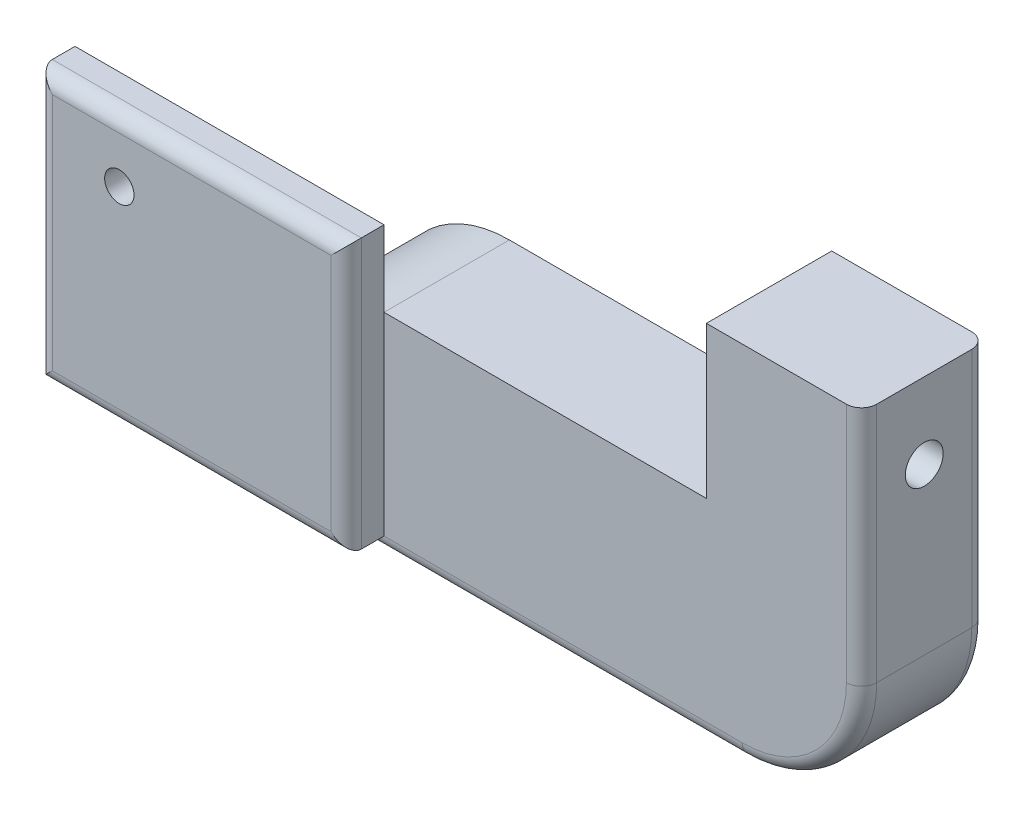
ISO-10303-21;
HEADER;
FILE_DESCRIPTION(('STEP AP214'),'2;1');
FILE_NAME('part.step','',(''),(''),'','','');
FILE_SCHEMA(('AUTOMOTIVE_DESIGN { 1 0 10303 214 1 1 1 1 }'));
ENDSEC;
DATA;
#1=APPLICATION_CONTEXT('core data for automotive mechanical design processes');
#2=APPLICATION_PROTOCOL_DEFINITION('international standard','automotive_design',2000,#1);
#3=PRODUCT_CONTEXT('',#1,'mechanical');
#4=PRODUCT('Part','Part','',(#3));
#5=PRODUCT_RELATED_PRODUCT_CATEGORY('part','',(#4));
#6=PRODUCT_DEFINITION_FORMATION('','',#4);
#7=PRODUCT_DEFINITION_CONTEXT('part definition',#1,'design');
#8=PRODUCT_DEFINITION('design','',#6,#7);
#9=PRODUCT_DEFINITION_SHAPE('','',#8);
#10=(LENGTH_UNIT() NAMED_UNIT(*) SI_UNIT(.MILLI.,.METRE.));
#11=(NAMED_UNIT(*) PLANE_ANGLE_UNIT() SI_UNIT($,.RADIAN.));
#12=(NAMED_UNIT(*) SI_UNIT($,.STERADIAN.) SOLID_ANGLE_UNIT());
#13=UNCERTAINTY_MEASURE_WITH_UNIT(LENGTH_MEASURE(1.E-05),#10,'distance_accuracy_value','');
#14=(GEOMETRIC_REPRESENTATION_CONTEXT(3) GLOBAL_UNCERTAINTY_ASSIGNED_CONTEXT((#13)) GLOBAL_UNIT_ASSIGNED_CONTEXT((#10,
#11,#12)) REPRESENTATION_CONTEXT('',''));
#15=CARTESIAN_POINT('',(0.,0.,0.));
#16=DIRECTION('',(0.,0.,1.));
#17=DIRECTION('',(1.,0.,0.));
#18=AXIS2_PLACEMENT_3D('',#15,#16,#17);
#19=CARTESIAN_POINT('',(24.,30.2,10.5));
#20=DIRECTION('',(-1.,0.,0.));
#21=DIRECTION('',(0.,0.,1.));
#22=AXIS2_PLACEMENT_3D('',#19,#20,#21);
#23=CYLINDRICAL_SURFACE('',#22,3.175);
#24=CARTESIAN_POINT('',(50.,30.2,10.5));
#25=DIRECTION('',(-1.,0.,0.));
#26=DIRECTION('',(0.,0.,1.));
#27=AXIS2_PLACEMENT_3D('',#24,#25,#26);
#28=CIRCLE('',#27,3.175);
#29=CARTESIAN_POINT('',(50.,30.2,13.675));
#30=VERTEX_POINT('',#29);
#31=EDGE_CURVE('E245',#30,#30,#28,.T.);
#32=ORIENTED_EDGE('',*,*,#31,.F.);
#33=EDGE_LOOP('',(#32));
#34=FACE_BOUND('',#33,.T.);
#35=CARTESIAN_POINT('',(40.475,30.2,10.5));
#36=DIRECTION('',(-1.,0.,0.));
#37=DIRECTION('',(0.,-1.,0.));
#38=AXIS2_PLACEMENT_3D('',#35,#36,#37);
#39=CIRCLE('',#38,3.175);
#40=CARTESIAN_POINT('',(40.475,27.025,10.5));
#41=VERTEX_POINT('',#40);
#42=EDGE_CURVE('E41',#41,#41,#39,.F.);
#43=ORIENTED_EDGE('',*,*,#42,.F.);
#44=EDGE_LOOP('',(#43));
#45=FACE_BOUND('',#44,.T.);
#46=ADVANCED_FACE('F37',(#34,#45),#23,.F.);
#47=CARTESIAN_POINT('',(-30.,-2.5,21.));
#48=DIRECTION('',(0.,0.,-1.));
#49=DIRECTION('',(-1.,0.,0.));
#50=AXIS2_PLACEMENT_3D('',#47,#48,#49);
#51=PLANE('',#50);
#52=DIRECTION('',(0.,1.,0.));
#53=VECTOR('',#52,1.);
#54=CARTESIAN_POINT('',(-30.,-14.96,21.));
#55=LINE('',#54,#53);
#56=CARTESIAN_POINT('',(-30.,-14.96,21.));
#57=VERTEX_POINT('',#56);
#58=CARTESIAN_POINT('',(-30.,17.5,21.));
#59=VERTEX_POINT('',#58);
#60=EDGE_CURVE('E257',#57,#59,#55,.T.);
#61=ORIENTED_EDGE('',*,*,#60,.F.);
#62=DIRECTION('',(1.,0.,0.));
#63=VECTOR('',#62,1.);
#64=CARTESIAN_POINT('',(-30.,-14.96,21.));
#65=LINE('',#64,#63);
#66=CARTESIAN_POINT('',(30.,-14.96,21.));
#67=VERTEX_POINT('',#66);
#68=EDGE_CURVE('E330',#57,#67,#65,.T.);
#69=ORIENTED_EDGE('',*,*,#68,.T.);
#70=CARTESIAN_POINT('',(30.,2.5,21.));
#71=DIRECTION('',(0.,0.,-1.));
#72=DIRECTION('',(-1.,0.,0.));
#73=AXIS2_PLACEMENT_3D('',#70,#71,#72);
#74=CIRCLE('',#73,17.46);
#75=CARTESIAN_POINT('',(47.46,2.5,21.));
#76=VERTEX_POINT('',#75);
#77=EDGE_CURVE('E328',#67,#76,#74,.F.);
#78=ORIENTED_EDGE('',*,*,#77,.T.);
#79=DIRECTION('',(0.,1.,0.));
#80=VECTOR('',#79,1.);
#81=CARTESIAN_POINT('',(47.46,-2.50000000000003,21.));
#82=LINE('',#81,#80);
#83=CARTESIAN_POINT('',(47.46,42.9,21.));
#84=VERTEX_POINT('',#83);
#85=EDGE_CURVE('E326',#76,#84,#82,.T.);
#86=ORIENTED_EDGE('',*,*,#85,.T.);
#87=DIRECTION('',(-1.,0.,0.));
#88=VECTOR('',#87,1.);
#89=CARTESIAN_POINT('',(24.,42.9,21.));
#90=LINE('',#89,#88);
#91=CARTESIAN_POINT('',(24.,42.9,21.));
#92=VERTEX_POINT('',#91);
#93=EDGE_CURVE('E278',#84,#92,#90,.T.);
#94=ORIENTED_EDGE('',*,*,#93,.T.);
#95=DIRECTION('',(0.,-1.,0.));
#96=VECTOR('',#95,1.);
#97=CARTESIAN_POINT('',(24.,17.5,21.));
#98=LINE('',#97,#96);
#99=CARTESIAN_POINT('',(24.,17.5,21.));
#100=VERTEX_POINT('',#99);
#101=EDGE_CURVE('E280',#92,#100,#98,.T.);
#102=ORIENTED_EDGE('',*,*,#101,.T.);
#103=DIRECTION('',(-1.,0.,0.));
#104=VECTOR('',#103,1.);
#105=CARTESIAN_POINT('',(-30.,17.5,21.));
#106=LINE('',#105,#104);
#107=EDGE_CURVE('E283',#100,#59,#106,.T.);
#108=ORIENTED_EDGE('',*,*,#107,.T.);
#109=EDGE_LOOP('',(#61,#69,#78,#86,#94,#102,#108));
#110=FACE_BOUND('',#109,.T.);
#111=ADVANCED_FACE('F470',(#110),#51,.F.);
#112=CARTESIAN_POINT('',(24.,42.9,21.));
#113=DIRECTION('',(0.,-1.,0.));
#114=DIRECTION('',(0.,0.,-1.));
#115=AXIS2_PLACEMENT_3D('',#112,#113,#114);
#116=PLANE('',#115);
#117=ORIENTED_EDGE('',*,*,#93,.F.);
#118=CARTESIAN_POINT('',(47.46,42.9,18.46));
#119=DIRECTION('',(0.,-1.,0.));
#120=DIRECTION('',(0.,0.,-1.));
#121=AXIS2_PLACEMENT_3D('',#118,#119,#120);
#122=CIRCLE('',#121,2.54);
#123=CARTESIAN_POINT('',(50.,42.9,18.46));
#124=VERTEX_POINT('',#123);
#125=EDGE_CURVE('E355',#84,#124,#122,.F.);
#126=ORIENTED_EDGE('',*,*,#125,.T.);
#127=DIRECTION('',(0.,0.,-1.));
#128=VECTOR('',#127,1.);
#129=CARTESIAN_POINT('',(50.,42.9,21.));
#130=LINE('',#129,#128);
#131=CARTESIAN_POINT('',(50.,42.9,2.54000000000001));
#132=VERTEX_POINT('',#131);
#133=EDGE_CURVE('E323',#124,#132,#130,.T.);
#134=ORIENTED_EDGE('',*,*,#133,.T.);
#135=CARTESIAN_POINT('',(47.46,42.9,2.54));
#136=DIRECTION('',(0.,-1.,0.));
#137=DIRECTION('',(0.,0.,-1.));
#138=AXIS2_PLACEMENT_3D('',#135,#136,#137);
#139=CIRCLE('',#138,2.54);
#140=CARTESIAN_POINT('',(47.46,42.9,0.));
#141=VERTEX_POINT('',#140);
#142=EDGE_CURVE('E353',#132,#141,#139,.F.);
#143=ORIENTED_EDGE('',*,*,#142,.T.);
#144=DIRECTION('',(-1.,0.,0.));
#145=VECTOR('',#144,1.);
#146=CARTESIAN_POINT('',(24.,42.9,0.));
#147=LINE('',#146,#145);
#148=CARTESIAN_POINT('',(24.,42.9,0.));
#149=VERTEX_POINT('',#148);
#150=EDGE_CURVE('E292',#141,#149,#147,.T.);
#151=ORIENTED_EDGE('',*,*,#150,.T.);
#152=DIRECTION('',(0.,0.,-1.));
#153=VECTOR('',#152,1.);
#154=CARTESIAN_POINT('',(24.,42.9,21.));
#155=LINE('',#154,#153);
#156=EDGE_CURVE('E320',#92,#149,#155,.T.);
#157=ORIENTED_EDGE('',*,*,#156,.F.);
#158=EDGE_LOOP('',(#117,#126,#134,#143,#151,#157));
#159=FACE_BOUND('',#158,.T.);
#160=ADVANCED_FACE('F456',(#159),#116,.F.);
#161=CARTESIAN_POINT('',(24.,17.5,21.));
#162=DIRECTION('',(1.,0.,0.));
#163=DIRECTION('',(0.,0.,-1.));
#164=AXIS2_PLACEMENT_3D('',#161,#162,#163);
#165=PLANE('',#164);
#166=DIRECTION('',(0.,0.,-1.));
#167=VECTOR('',#166,1.);
#168=CARTESIAN_POINT('',(24.,35.88325,13.7812259173719));
#169=LINE('',#168,#167);
#170=CARTESIAN_POINT('',(24.,35.88325,13.7812259173719));
#171=VERTEX_POINT('',#170);
#172=CARTESIAN_POINT('',(24.,35.88325,7.21877408262805));
#173=VERTEX_POINT('',#172);
#174=EDGE_CURVE('E215',#171,#173,#169,.T.);
#175=ORIENTED_EDGE('',*,*,#174,.F.);
#176=DIRECTION('',(0.,0.866025403784439,-0.5));
#177=VECTOR('',#176,1.);
#178=CARTESIAN_POINT('',(24.,30.2,17.0624518347439));
#179=LINE('',#178,#177);
#180=CARTESIAN_POINT('',(24.,30.2,17.0624518347439));
#181=VERTEX_POINT('',#180);
#182=EDGE_CURVE('E54',#181,#171,#179,.T.);
#183=ORIENTED_EDGE('',*,*,#182,.F.);
#184=DIRECTION('',(0.,0.866025403784438,0.5));
#185=VECTOR('',#184,1.);
#186=CARTESIAN_POINT('',(24.,24.51675,13.7812259173719));
#187=LINE('',#186,#185);
#188=CARTESIAN_POINT('',(24.,24.51675,13.7812259173719));
#189=VERTEX_POINT('',#188);
#190=EDGE_CURVE('E231',#189,#181,#187,.T.);
#191=ORIENTED_EDGE('',*,*,#190,.F.);
#192=DIRECTION('',(0.,0.,1.));
#193=VECTOR('',#192,1.);
#194=CARTESIAN_POINT('',(24.,24.51675,7.21877408262806));
#195=LINE('',#194,#193);
#196=CARTESIAN_POINT('',(24.,24.51675,7.21877408262806));
#197=VERTEX_POINT('',#196);
#198=EDGE_CURVE('E225',#197,#189,#195,.T.);
#199=ORIENTED_EDGE('',*,*,#198,.F.);
#200=DIRECTION('',(0.,-0.866025403784439,0.5));
#201=VECTOR('',#200,1.);
#202=CARTESIAN_POINT('',(24.,30.2,3.93754816525612));
#203=LINE('',#202,#201);
#204=CARTESIAN_POINT('',(24.,30.2,3.93754816525612));
#205=VERTEX_POINT('',#204);
#206=EDGE_CURVE('E223',#205,#197,#203,.T.);
#207=ORIENTED_EDGE('',*,*,#206,.F.);
#208=DIRECTION('',(0.,-0.866025403784439,-0.5));
#209=VECTOR('',#208,1.);
#210=CARTESIAN_POINT('',(24.,35.88325,7.21877408262805));
#211=LINE('',#210,#209);
#212=EDGE_CURVE('E205',#173,#205,#211,.T.);
#213=ORIENTED_EDGE('',*,*,#212,.F.);
#214=EDGE_LOOP('',(#175,#183,#191,#199,#207,#213));
#215=FACE_BOUND('',#214,.T.);
#216=DIRECTION('',(0.,-1.,0.));
#217=VECTOR('',#216,1.);
#218=CARTESIAN_POINT('',(24.,17.5,0.));
#219=LINE('',#218,#217);
#220=CARTESIAN_POINT('',(24.,17.5,0.));
#221=VERTEX_POINT('',#220);
#222=EDGE_CURVE('E294',#149,#221,#219,.T.);
#223=ORIENTED_EDGE('',*,*,#222,.T.);
#224=DIRECTION('',(0.,0.,-1.));
#225=VECTOR('',#224,1.);
#226=CARTESIAN_POINT('',(24.,17.5,21.));
#227=LINE('',#226,#225);
#228=EDGE_CURVE('E317',#100,#221,#227,.T.);
#229=ORIENTED_EDGE('',*,*,#228,.F.);
#230=ORIENTED_EDGE('',*,*,#101,.F.);
#231=ORIENTED_EDGE('',*,*,#156,.T.);
#232=EDGE_LOOP('',(#223,#229,#230,#231));
#233=FACE_BOUND('',#232,.T.);
#234=ADVANCED_FACE('F219',(#215,#233),#165,.F.);
#235=CARTESIAN_POINT('',(-30.,17.5,21.));
#236=DIRECTION('',(0.,-1.,0.));
#237=DIRECTION('',(1.,0.,0.));
#238=AXIS2_PLACEMENT_3D('',#235,#236,#237);
#239=PLANE('',#238);
#240=DIRECTION('',(-1.,0.,0.));
#241=VECTOR('',#240,1.);
#242=CARTESIAN_POINT('',(-30.,17.5,0.));
#243=LINE('',#242,#241);
#244=CARTESIAN_POINT('',(-30.,17.5,0.));
#245=VERTEX_POINT('',#244);
#246=EDGE_CURVE('E297',#221,#245,#243,.T.);
#247=ORIENTED_EDGE('',*,*,#246,.T.);
#248=DIRECTION('',(0.,0.,-1.));
#249=VECTOR('',#248,1.);
#250=CARTESIAN_POINT('',(-30.,17.5,21.));
#251=LINE('',#250,#249);
#252=EDGE_CURVE('E314',#59,#245,#251,.T.);
#253=ORIENTED_EDGE('',*,*,#252,.F.);
#254=ORIENTED_EDGE('',*,*,#107,.F.);
#255=ORIENTED_EDGE('',*,*,#228,.T.);
#256=EDGE_LOOP('',(#247,#253,#254,#255));
#257=FACE_BOUND('',#256,.T.);
#258=ADVANCED_FACE('F467',(#257),#239,.F.);
#259=CARTESIAN_POINT('',(-30.,-2.5,21.));
#260=DIRECTION('',(0.,0.,-1.));
#261=DIRECTION('',(-1.,0.,0.));
#262=AXIS2_PLACEMENT_3D('',#259,#260,#261);
#263=CYLINDRICAL_SURFACE('',#262,20.);
#264=CARTESIAN_POINT('',(-30.,-2.5,0.));
#265=DIRECTION('',(0.,0.,1.));
#266=DIRECTION('',(-1.,0.,0.));
#267=AXIS2_PLACEMENT_3D('',#264,#265,#266);
#268=CIRCLE('',#267,20.);
#269=CARTESIAN_POINT('',(-50.,-2.5,0.));
#270=VERTEX_POINT('',#269);
#271=EDGE_CURVE('E299',#245,#270,#268,.T.);
#272=ORIENTED_EDGE('',*,*,#271,.T.);
#273=DIRECTION('',(0.,0.,-1.));
#274=VECTOR('',#273,1.);
#275=CARTESIAN_POINT('',(-50.,-2.5,21.));
#276=LINE('',#275,#274);
#277=CARTESIAN_POINT('',(-50.,-2.5,21.));
#278=VERTEX_POINT('',#277);
#279=EDGE_CURVE('E311',#278,#270,#276,.T.);
#280=ORIENTED_EDGE('',*,*,#279,.F.);
#281=CARTESIAN_POINT('',(-30.,-2.5,21.));
#282=DIRECTION('',(0.,0.,1.));
#283=DIRECTION('',(-1.,0.,0.));
#284=AXIS2_PLACEMENT_3D('',#281,#282,#283);
#285=CIRCLE('',#284,20.);
#286=EDGE_CURVE('E285',#59,#278,#285,.T.);
#287=ORIENTED_EDGE('',*,*,#286,.F.);
#288=ORIENTED_EDGE('',*,*,#252,.T.);
#289=EDGE_LOOP('',(#272,#280,#287,#288));
#290=FACE_BOUND('',#289,.T.);
#291=ADVANCED_FACE('F534',(#290),#263,.T.);
#292=CARTESIAN_POINT('',(-50.,-17.5,21.));
#293=DIRECTION('',(1.,0.,0.));
#294=DIRECTION('',(0.,1.,0.));
#295=AXIS2_PLACEMENT_3D('',#292,#293,#294);
#296=PLANE('',#295);
#297=DIRECTION('',(0.,0.,-1.));
#298=VECTOR('',#297,1.);
#299=CARTESIAN_POINT('',(-50.,-17.5,21.));
#300=LINE('',#299,#298);
#301=CARTESIAN_POINT('',(-50.,-17.5,18.46));
#302=VERTEX_POINT('',#301);
#303=CARTESIAN_POINT('',(-50.,-17.5,2.54000000000001));
#304=VERTEX_POINT('',#303);
#305=EDGE_CURVE('E308',#302,#304,#300,.T.);
#306=ORIENTED_EDGE('',*,*,#305,.F.);
#307=CARTESIAN_POINT('',(-50.,-14.96,18.46));
#308=DIRECTION('',(1.,0.,0.));
#309=DIRECTION('',(0.,1.,0.));
#310=AXIS2_PLACEMENT_3D('',#307,#308,#309);
#311=CIRCLE('',#310,2.54);
#312=CARTESIAN_POINT('',(-50.,-14.96,21.));
#313=VERTEX_POINT('',#312);
#314=EDGE_CURVE('E341',#302,#313,#311,.F.);
#315=ORIENTED_EDGE('',*,*,#314,.T.);
#316=DIRECTION('',(0.,-1.,0.));
#317=VECTOR('',#316,1.);
#318=CARTESIAN_POINT('',(-50.,-17.5,21.));
#319=LINE('',#318,#317);
#320=EDGE_CURVE('E288',#278,#313,#319,.T.);
#321=ORIENTED_EDGE('',*,*,#320,.F.);
#322=ORIENTED_EDGE('',*,*,#279,.T.);
#323=DIRECTION('',(0.,-1.,0.));
#324=VECTOR('',#323,1.);
#325=CARTESIAN_POINT('',(-50.,-17.5,0.));
#326=LINE('',#325,#324);
#327=CARTESIAN_POINT('',(-50.,-14.96,0.));
#328=VERTEX_POINT('',#327);
#329=EDGE_CURVE('E281',#270,#328,#326,.T.);
#330=ORIENTED_EDGE('',*,*,#329,.T.);
#331=CARTESIAN_POINT('',(-50.,-14.96,2.54));
#332=DIRECTION('',(1.,0.,0.));
#333=DIRECTION('',(0.,1.,0.));
#334=AXIS2_PLACEMENT_3D('',#331,#332,#333);
#335=CIRCLE('',#334,2.54);
#336=EDGE_CURVE('E339',#328,#304,#335,.F.);
#337=ORIENTED_EDGE('',*,*,#336,.T.);
#338=EDGE_LOOP('',(#306,#315,#321,#322,#330,#337));
#339=FACE_BOUND('',#338,.T.);
#340=ADVANCED_FACE('F424',(#339),#296,.F.);
#341=CARTESIAN_POINT('',(-50.,-17.5,21.));
#342=DIRECTION('',(0.,1.,0.));
#343=DIRECTION('',(-1.,0.,0.));
#344=AXIS2_PLACEMENT_3D('',#341,#342,#343);
#345=PLANE('',#344);
#346=DIRECTION('',(0.,0.,-1.));
#347=VECTOR('',#346,1.);
#348=CARTESIAN_POINT('',(30.,-17.5,21.));
#349=LINE('',#348,#347);
#350=CARTESIAN_POINT('',(30.,-17.5,18.46));
#351=VERTEX_POINT('',#350);
#352=CARTESIAN_POINT('',(30.,-17.5,2.54000000000001));
#353=VERTEX_POINT('',#352);
#354=EDGE_CURVE('E305',#351,#353,#349,.T.);
#355=ORIENTED_EDGE('',*,*,#354,.F.);
#356=DIRECTION('',(1.,0.,0.));
#357=VECTOR('',#356,1.);
#358=CARTESIAN_POINT('',(-50.,-17.5,18.46));
#359=LINE('',#358,#357);
#360=EDGE_CURVE('E337',#351,#302,#359,.F.);
#361=ORIENTED_EDGE('',*,*,#360,.T.);
#362=ORIENTED_EDGE('',*,*,#305,.T.);
#363=DIRECTION('',(1.,0.,0.));
#364=VECTOR('',#363,1.);
#365=CARTESIAN_POINT('',(30.,-17.5,2.54));
#366=LINE('',#365,#364);
#367=EDGE_CURVE('E334',#304,#353,#366,.T.);
#368=ORIENTED_EDGE('',*,*,#367,.T.);
#369=EDGE_LOOP('',(#355,#361,#362,#368));
#370=FACE_BOUND('',#369,.T.);
#371=ADVANCED_FACE('F430',(#370),#345,.F.);
#372=CARTESIAN_POINT('',(30.,2.5,21.));
#373=DIRECTION('',(0.,0.,-1.));
#374=DIRECTION('',(-1.,0.,0.));
#375=AXIS2_PLACEMENT_3D('',#372,#373,#374);
#376=CYLINDRICAL_SURFACE('',#375,20.);
#377=DIRECTION('',(0.,0.,-1.));
#378=VECTOR('',#377,1.);
#379=CARTESIAN_POINT('',(50.,2.5,21.));
#380=LINE('',#379,#378);
#381=CARTESIAN_POINT('',(50.,2.5,18.46));
#382=VERTEX_POINT('',#381);
#383=CARTESIAN_POINT('',(50.,2.5,2.54000000000001));
#384=VERTEX_POINT('',#383);
#385=EDGE_CURVE('E291',#382,#384,#380,.T.);
#386=ORIENTED_EDGE('',*,*,#385,.F.);
#387=CARTESIAN_POINT('',(30.,2.5,18.46));
#388=DIRECTION('',(0.,0.,-1.));
#389=DIRECTION('',(-1.,0.,0.));
#390=AXIS2_PLACEMENT_3D('',#387,#388,#389);
#391=CIRCLE('',#390,20.);
#392=EDGE_CURVE('E345',#382,#351,#391,.T.);
#393=ORIENTED_EDGE('',*,*,#392,.T.);
#394=ORIENTED_EDGE('',*,*,#354,.T.);
#395=CARTESIAN_POINT('',(30.,2.5,2.54));
#396=DIRECTION('',(0.,0.,-1.));
#397=DIRECTION('',(-1.,0.,0.));
#398=AXIS2_PLACEMENT_3D('',#395,#396,#397);
#399=CIRCLE('',#398,20.);
#400=EDGE_CURVE('E343',#353,#384,#399,.F.);
#401=ORIENTED_EDGE('',*,*,#400,.T.);
#402=EDGE_LOOP('',(#386,#393,#394,#401));
#403=FACE_BOUND('',#402,.T.);
#404=ADVANCED_FACE('F442',(#403),#376,.T.);
#405=CARTESIAN_POINT('',(50.,2.5,21.));
#406=DIRECTION('',(-1.,0.,0.));
#407=DIRECTION('',(0.,-1.,0.));
#408=AXIS2_PLACEMENT_3D('',#405,#406,#407);
#409=PLANE('',#408);
#410=ORIENTED_EDGE('',*,*,#31,.T.);
#411=EDGE_LOOP('',(#410));
#412=FACE_BOUND('',#411,.T.);
#413=ORIENTED_EDGE('',*,*,#133,.F.);
#414=DIRECTION('',(0.,1.,0.));
#415=VECTOR('',#414,1.);
#416=CARTESIAN_POINT('',(50.,2.5,18.46));
#417=LINE('',#416,#415);
#418=EDGE_CURVE('E359',#124,#382,#417,.F.);
#419=ORIENTED_EDGE('',*,*,#418,.T.);
#420=ORIENTED_EDGE('',*,*,#385,.T.);
#421=DIRECTION('',(0.,1.,0.));
#422=VECTOR('',#421,1.);
#423=CARTESIAN_POINT('',(50.,42.9,2.54));
#424=LINE('',#423,#422);
#425=EDGE_CURVE('E357',#384,#132,#424,.T.);
#426=ORIENTED_EDGE('',*,*,#425,.T.);
#427=EDGE_LOOP('',(#413,#419,#420,#426));
#428=FACE_BOUND('',#427,.T.);
#429=ADVANCED_FACE('F447',(#412,#428),#409,.F.);
#430=CARTESIAN_POINT('',(-30.,-2.5,0.));
#431=DIRECTION('',(0.,0.,-1.));
#432=DIRECTION('',(-1.,0.,0.));
#433=AXIS2_PLACEMENT_3D('',#430,#431,#432);
#434=PLANE('',#433);
#435=CARTESIAN_POINT('',(30.,2.5,0.));
#436=DIRECTION('',(0.,0.,-1.));
#437=DIRECTION('',(-1.,0.,0.));
#438=AXIS2_PLACEMENT_3D('',#435,#436,#437);
#439=CIRCLE('',#438,17.46);
#440=CARTESIAN_POINT('',(47.46,2.5,0.));
#441=VERTEX_POINT('',#440);
#442=CARTESIAN_POINT('',(30.,-14.96,0.));
#443=VERTEX_POINT('',#442);
#444=EDGE_CURVE('E349',#441,#443,#439,.T.);
#445=ORIENTED_EDGE('',*,*,#444,.T.);
#446=DIRECTION('',(1.,0.,0.));
#447=VECTOR('',#446,1.);
#448=CARTESIAN_POINT('',(-50.,-14.96,0.));
#449=LINE('',#448,#447);
#450=EDGE_CURVE('E351',#443,#328,#449,.F.);
#451=ORIENTED_EDGE('',*,*,#450,.T.);
#452=ORIENTED_EDGE('',*,*,#329,.F.);
#453=ORIENTED_EDGE('',*,*,#271,.F.);
#454=ORIENTED_EDGE('',*,*,#246,.F.);
#455=ORIENTED_EDGE('',*,*,#222,.F.);
#456=ORIENTED_EDGE('',*,*,#150,.F.);
#457=DIRECTION('',(0.,1.,0.));
#458=VECTOR('',#457,1.);
#459=CARTESIAN_POINT('',(47.46,2.5,0.));
#460=LINE('',#459,#458);
#461=EDGE_CURVE('E347',#141,#441,#460,.F.);
#462=ORIENTED_EDGE('',*,*,#461,.T.);
#463=EDGE_LOOP('',(#445,#451,#452,#453,#454,#455,#456,#462));
#464=FACE_BOUND('',#463,.T.);
#465=ADVANCED_FACE('F460',(#464),#434,.T.);
#466=CARTESIAN_POINT('',(47.46,-2.50000000000003,18.46));
#467=DIRECTION('',(0.,1.,0.));
#468=DIRECTION('',(-1.,0.,0.));
#469=AXIS2_PLACEMENT_3D('',#466,#467,#468);
#470=CYLINDRICAL_SURFACE('',#469,2.54);
#471=ORIENTED_EDGE('',*,*,#125,.F.);
#472=ORIENTED_EDGE('',*,*,#85,.F.);
#473=CARTESIAN_POINT('',(47.46,2.5,18.46));
#474=DIRECTION('',(0.,-1.,0.));
#475=DIRECTION('',(0.,0.,-1.));
#476=AXIS2_PLACEMENT_3D('',#473,#474,#475);
#477=CIRCLE('',#476,2.54);
#478=EDGE_CURVE('E295',#382,#76,#477,.T.);
#479=ORIENTED_EDGE('',*,*,#478,.F.);
#480=ORIENTED_EDGE('',*,*,#418,.F.);
#481=EDGE_LOOP('',(#471,#472,#479,#480));
#482=FACE_BOUND('',#481,.T.);
#483=ADVANCED_FACE('F474',(#482),#470,.T.);
#484=CARTESIAN_POINT('',(30.,2.5,18.46));
#485=DIRECTION('',(0.,0.,-1.));
#486=DIRECTION('',(-1.,0.,0.));
#487=AXIS2_PLACEMENT_3D('',#484,#485,#486);
#488=TOROIDAL_SURFACE('',#487,17.46,2.54);
#489=ORIENTED_EDGE('',*,*,#478,.T.);
#490=ORIENTED_EDGE('',*,*,#77,.F.);
#491=CARTESIAN_POINT('',(30.,-14.96,18.46));
#492=DIRECTION('',(-1.,0.,0.));
#493=DIRECTION('',(0.,0.,1.));
#494=AXIS2_PLACEMENT_3D('',#491,#492,#493);
#495=CIRCLE('',#494,2.54);
#496=EDGE_CURVE('E362',#351,#67,#495,.T.);
#497=ORIENTED_EDGE('',*,*,#496,.F.);
#498=ORIENTED_EDGE('',*,*,#392,.F.);
#499=EDGE_LOOP('',(#489,#490,#497,#498));
#500=FACE_BOUND('',#499,.T.);
#501=ADVANCED_FACE('F479',(#500),#488,.T.);
#502=CARTESIAN_POINT('',(-30.,-14.96,18.46));
#503=DIRECTION('',(1.,0.,0.));
#504=DIRECTION('',(0.,1.,0.));
#505=AXIS2_PLACEMENT_3D('',#502,#503,#504);
#506=CYLINDRICAL_SURFACE('',#505,2.54);
#507=ORIENTED_EDGE('',*,*,#314,.F.);
#508=ORIENTED_EDGE('',*,*,#360,.F.);
#509=ORIENTED_EDGE('',*,*,#496,.T.);
#510=ORIENTED_EDGE('',*,*,#68,.F.);
#511=EDGE_CURVE('E331',#313,#57,#65,.T.);
#512=ORIENTED_EDGE('',*,*,#511,.F.);
#513=EDGE_LOOP('',(#507,#508,#509,#510,#512));
#514=FACE_BOUND('',#513,.T.);
#515=ADVANCED_FACE('F413',(#514),#506,.T.);
#516=CARTESIAN_POINT('',(47.46,2.5,2.54));
#517=DIRECTION('',(0.,-1.,0.));
#518=DIRECTION('',(1.,0.,0.));
#519=AXIS2_PLACEMENT_3D('',#516,#517,#518);
#520=CYLINDRICAL_SURFACE('',#519,2.54);
#521=ORIENTED_EDGE('',*,*,#142,.F.);
#522=ORIENTED_EDGE('',*,*,#425,.F.);
#523=CARTESIAN_POINT('',(47.46,2.5,2.54));
#524=DIRECTION('',(0.,-1.,0.));
#525=DIRECTION('',(0.,0.,-1.));
#526=AXIS2_PLACEMENT_3D('',#523,#524,#525);
#527=CIRCLE('',#526,2.54);
#528=EDGE_CURVE('E365',#441,#384,#527,.T.);
#529=ORIENTED_EDGE('',*,*,#528,.F.);
#530=ORIENTED_EDGE('',*,*,#461,.F.);
#531=EDGE_LOOP('',(#521,#522,#529,#530));
#532=FACE_BOUND('',#531,.T.);
#533=ADVANCED_FACE('F451',(#532),#520,.T.);
#534=CARTESIAN_POINT('',(30.,2.5,2.54));
#535=DIRECTION('',(0.,0.,-1.));
#536=DIRECTION('',(-1.,0.,0.));
#537=AXIS2_PLACEMENT_3D('',#534,#535,#536);
#538=TOROIDAL_SURFACE('',#537,17.46,2.54);
#539=ORIENTED_EDGE('',*,*,#528,.T.);
#540=ORIENTED_EDGE('',*,*,#400,.F.);
#541=CARTESIAN_POINT('',(30.,-14.96,2.54));
#542=DIRECTION('',(-1.,0.,0.));
#543=DIRECTION('',(0.,0.,1.));
#544=AXIS2_PLACEMENT_3D('',#541,#542,#543);
#545=CIRCLE('',#544,2.54);
#546=EDGE_CURVE('E277',#443,#353,#545,.T.);
#547=ORIENTED_EDGE('',*,*,#546,.F.);
#548=ORIENTED_EDGE('',*,*,#444,.F.);
#549=EDGE_LOOP('',(#539,#540,#547,#548));
#550=FACE_BOUND('',#549,.T.);
#551=ADVANCED_FACE('F438',(#550),#538,.T.);
#552=CARTESIAN_POINT('',(-50.,-14.96,2.54));
#553=DIRECTION('',(-1.,0.,0.));
#554=DIRECTION('',(0.,-1.,0.));
#555=AXIS2_PLACEMENT_3D('',#552,#553,#554);
#556=CYLINDRICAL_SURFACE('',#555,2.54);
#557=ORIENTED_EDGE('',*,*,#336,.F.);
#558=ORIENTED_EDGE('',*,*,#450,.F.);
#559=ORIENTED_EDGE('',*,*,#546,.T.);
#560=ORIENTED_EDGE('',*,*,#367,.F.);
#561=EDGE_LOOP('',(#557,#558,#559,#560));
#562=FACE_BOUND('',#561,.T.);
#563=ADVANCED_FACE('F432',(#562),#556,.T.);
#564=CARTESIAN_POINT('',(0.,0.,21.));
#565=DIRECTION('',(0.,0.,1.));
#566=DIRECTION('',(1.,0.,0.));
#567=AXIS2_PLACEMENT_3D('',#564,#565,#566);
#568=PLANE('',#567);
#569=CARTESIAN_POINT('',(-68.,19.9,21.));
#570=DIRECTION('',(0.,0.,1.));
#571=DIRECTION('',(1.,0.,0.));
#572=AXIS2_PLACEMENT_3D('',#569,#570,#571);
#573=CIRCLE('',#572,2.45745);
#574=CARTESIAN_POINT('',(-65.54255,19.9,21.));
#575=VERTEX_POINT('',#574);
#576=EDGE_CURVE('E252',#575,#575,#573,.T.);
#577=ORIENTED_EDGE('',*,*,#576,.T.);
#578=EDGE_LOOP('',(#577));
#579=FACE_BOUND('',#578,.T.);
#580=CARTESIAN_POINT('',(-30.,30.2,21.));
#581=VERTEX_POINT('',#580);
#582=EDGE_CURVE('E256',#59,#581,#55,.T.);
#583=ORIENTED_EDGE('',*,*,#582,.F.);
#584=ORIENTED_EDGE('',*,*,#286,.T.);
#585=ORIENTED_EDGE('',*,*,#320,.T.);
#586=DIRECTION('',(1.,0.,0.));
#587=VECTOR('',#586,1.);
#588=CARTESIAN_POINT('',(-30.,-14.96,21.));
#589=LINE('',#588,#587);
#590=CARTESIAN_POINT('',(-81.7709992502387,-14.96,21.));
#591=VERTEX_POINT('',#590);
#592=EDGE_CURVE('E266',#591,#313,#589,.T.);
#593=ORIENTED_EDGE('',*,*,#592,.F.);
#594=DIRECTION('',(0.,-1.,0.));
#595=VECTOR('',#594,1.);
#596=CARTESIAN_POINT('',(-81.7709992502387,-14.96,21.));
#597=LINE('',#596,#595);
#598=CARTESIAN_POINT('',(-81.7709992502387,30.2,21.));
#599=VERTEX_POINT('',#598);
#600=EDGE_CURVE('E263',#599,#591,#597,.T.);
#601=ORIENTED_EDGE('',*,*,#600,.F.);
#602=DIRECTION('',(-1.,0.,0.));
#603=VECTOR('',#602,1.);
#604=CARTESIAN_POINT('',(-30.,30.2,21.));
#605=LINE('',#604,#603);
#606=EDGE_CURVE('E260',#581,#599,#605,.T.);
#607=ORIENTED_EDGE('',*,*,#606,.F.);
#608=EDGE_LOOP('',(#583,#584,#585,#593,#601,#607));
#609=FACE_BOUND('',#608,.T.);
#610=ADVANCED_FACE('F419',(#579,#609),#568,.F.);
#611=CARTESIAN_POINT('',(-30.,-14.96,27.35));
#612=DIRECTION('',(-1.,0.,0.));
#613=DIRECTION('',(0.,0.,1.));
#614=AXIS2_PLACEMENT_3D('',#611,#612,#613);
#615=PLANE('',#614);
#616=DIRECTION('',(0.,0.,-1.));
#617=VECTOR('',#616,1.);
#618=CARTESIAN_POINT('',(-30.,30.2,27.35));
#619=LINE('',#618,#617);
#620=CARTESIAN_POINT('',(-30.,30.2,24.81));
#621=VERTEX_POINT('',#620);
#622=EDGE_CURVE('E275',#621,#581,#619,.T.);
#623=ORIENTED_EDGE('',*,*,#622,.F.);
#624=DIRECTION('',(0.,1.,0.));
#625=VECTOR('',#624,1.);
#626=CARTESIAN_POINT('',(-30.,-14.96,24.81));
#627=LINE('',#626,#625);
#628=CARTESIAN_POINT('',(-30.,-14.96,24.81));
#629=VERTEX_POINT('',#628);
#630=EDGE_CURVE('E46',#621,#629,#627,.F.);
#631=ORIENTED_EDGE('',*,*,#630,.T.);
#632=DIRECTION('',(0.,0.,-1.));
#633=VECTOR('',#632,1.);
#634=CARTESIAN_POINT('',(-30.,-14.96,27.35));
#635=LINE('',#634,#633);
#636=EDGE_CURVE('E269',#629,#57,#635,.T.);
#637=ORIENTED_EDGE('',*,*,#636,.T.);
#638=ORIENTED_EDGE('',*,*,#60,.T.);
#639=ORIENTED_EDGE('',*,*,#582,.T.);
#640=EDGE_LOOP('',(#623,#631,#637,#638,#639));
#641=FACE_BOUND('',#640,.T.);
#642=ADVANCED_FACE('F403',(#641),#615,.F.);
#643=CARTESIAN_POINT('',(-30.,30.2,27.35));
#644=DIRECTION('',(0.,-1.,0.));
#645=DIRECTION('',(1.,0.,0.));
#646=AXIS2_PLACEMENT_3D('',#643,#644,#645);
#647=PLANE('',#646);
#648=DIRECTION('',(0.,0.,-1.));
#649=VECTOR('',#648,1.);
#650=CARTESIAN_POINT('',(-81.7709992502387,30.2,27.35));
#651=LINE('',#650,#649);
#652=CARTESIAN_POINT('',(-81.7709992502387,30.2,24.81));
#653=VERTEX_POINT('',#652);
#654=EDGE_CURVE('E273',#653,#599,#651,.T.);
#655=ORIENTED_EDGE('',*,*,#654,.F.);
#656=DIRECTION('',(-1.,0.,0.));
#657=VECTOR('',#656,1.);
#658=CARTESIAN_POINT('',(-30.,30.2,24.81));
#659=LINE('',#658,#657);
#660=EDGE_CURVE('E12',#653,#621,#659,.F.);
#661=ORIENTED_EDGE('',*,*,#660,.T.);
#662=ORIENTED_EDGE('',*,*,#622,.T.);
#663=ORIENTED_EDGE('',*,*,#606,.T.);
#664=EDGE_LOOP('',(#655,#661,#662,#663));
#665=FACE_BOUND('',#664,.T.);
#666=ADVANCED_FACE('F517',(#665),#647,.F.);
#667=CARTESIAN_POINT('',(-81.7709992502387,-14.96,27.35));
#668=DIRECTION('',(1.,0.,0.));
#669=DIRECTION('',(0.,0.,-1.));
#670=AXIS2_PLACEMENT_3D('',#667,#668,#669);
#671=PLANE('',#670);
#672=DIRECTION('',(0.,0.,-1.));
#673=VECTOR('',#672,1.);
#674=CARTESIAN_POINT('',(-81.7709992502387,-14.96,27.35));
#675=LINE('',#674,#673);
#676=CARTESIAN_POINT('',(-81.7709992502387,-14.96,24.81));
#677=VERTEX_POINT('',#676);
#678=EDGE_CURVE('E271',#677,#591,#675,.T.);
#679=ORIENTED_EDGE('',*,*,#678,.F.);
#680=DIRECTION('',(0.,-1.,0.));
#681=VECTOR('',#680,1.);
#682=CARTESIAN_POINT('',(-81.7709992502387,30.2,24.81));
#683=LINE('',#682,#681);
#684=EDGE_CURVE('E379',#677,#653,#683,.F.);
#685=ORIENTED_EDGE('',*,*,#684,.T.);
#686=ORIENTED_EDGE('',*,*,#654,.T.);
#687=ORIENTED_EDGE('',*,*,#600,.T.);
#688=EDGE_LOOP('',(#679,#685,#686,#687));
#689=FACE_BOUND('',#688,.T.);
#690=ADVANCED_FACE('F514',(#689),#671,.F.);
#691=CARTESIAN_POINT('',(-30.,-14.96,27.35));
#692=DIRECTION('',(0.,1.,0.));
#693=DIRECTION('',(-1.,0.,0.));
#694=AXIS2_PLACEMENT_3D('',#691,#692,#693);
#695=PLANE('',#694);
#696=ORIENTED_EDGE('',*,*,#636,.F.);
#697=DIRECTION('',(1.,0.,0.));
#698=VECTOR('',#697,1.);
#699=CARTESIAN_POINT('',(-81.7709992502387,-14.96,24.81));
#700=LINE('',#699,#698);
#701=EDGE_CURVE('E382',#629,#677,#700,.F.);
#702=ORIENTED_EDGE('',*,*,#701,.T.);
#703=ORIENTED_EDGE('',*,*,#678,.T.);
#704=ORIENTED_EDGE('',*,*,#592,.T.);
#705=ORIENTED_EDGE('',*,*,#511,.T.);
#706=EDGE_LOOP('',(#696,#702,#703,#704,#705));
#707=FACE_BOUND('',#706,.T.);
#708=ADVANCED_FACE('F407',(#707),#695,.F.);
#709=CARTESIAN_POINT('',(0.,0.,27.35));
#710=DIRECTION('',(0.,0.,1.));
#711=DIRECTION('',(1.,0.,0.));
#712=AXIS2_PLACEMENT_3D('',#709,#710,#711);
#713=PLANE('',#712);
#714=DIRECTION('',(-1.,0.,0.));
#715=VECTOR('',#714,1.);
#716=CARTESIAN_POINT('',(-81.7709992502387,27.66,27.35));
#717=LINE('',#716,#715);
#718=CARTESIAN_POINT('',(-32.54,27.66,27.35));
#719=VERTEX_POINT('',#718);
#720=CARTESIAN_POINT('',(-79.2309992502387,27.66,27.35));
#721=VERTEX_POINT('',#720);
#722=EDGE_CURVE('E361',#719,#721,#717,.T.);
#723=ORIENTED_EDGE('',*,*,#722,.T.);
#724=DIRECTION('',(0.,-1.,0.));
#725=VECTOR('',#724,1.);
#726=CARTESIAN_POINT('',(-79.2309992502387,-14.96,27.35));
#727=LINE('',#726,#725);
#728=CARTESIAN_POINT('',(-79.2309992502387,-12.42,27.35));
#729=VERTEX_POINT('',#728);
#730=EDGE_CURVE('E376',#721,#729,#727,.T.);
#731=ORIENTED_EDGE('',*,*,#730,.T.);
#732=DIRECTION('',(1.,0.,0.));
#733=VECTOR('',#732,1.);
#734=CARTESIAN_POINT('',(-30.,-12.42,27.35));
#735=LINE('',#734,#733);
#736=CARTESIAN_POINT('',(-32.54,-12.42,27.35));
#737=VERTEX_POINT('',#736);
#738=EDGE_CURVE('E374',#729,#737,#735,.T.);
#739=ORIENTED_EDGE('',*,*,#738,.T.);
#740=DIRECTION('',(0.,1.,0.));
#741=VECTOR('',#740,1.);
#742=CARTESIAN_POINT('',(-32.54,30.2,27.35));
#743=LINE('',#742,#741);
#744=EDGE_CURVE('E372',#737,#719,#743,.T.);
#745=ORIENTED_EDGE('',*,*,#744,.T.);
#746=EDGE_LOOP('',(#723,#731,#739,#745));
#747=FACE_BOUND('',#746,.T.);
#748=CARTESIAN_POINT('',(-68.,19.9,27.35));
#749=DIRECTION('',(0.,0.,1.));
#750=DIRECTION('',(1.,0.,0.));
#751=AXIS2_PLACEMENT_3D('',#748,#749,#750);
#752=CIRCLE('',#751,2.45745);
#753=CARTESIAN_POINT('',(-65.54255,19.9,27.35));
#754=VERTEX_POINT('',#753);
#755=EDGE_CURVE('E249',#754,#754,#752,.T.);
#756=ORIENTED_EDGE('',*,*,#755,.F.);
#757=EDGE_LOOP('',(#756));
#758=FACE_BOUND('',#757,.T.);
#759=ADVANCED_FACE('F504',(#747,#758),#713,.T.);
#760=CARTESIAN_POINT('',(-68.,19.9,27.35));
#761=DIRECTION('',(0.,0.,1.));
#762=DIRECTION('',(1.,0.,0.));
#763=AXIS2_PLACEMENT_3D('',#760,#761,#762);
#764=CYLINDRICAL_SURFACE('',#763,2.45745);
#765=ORIENTED_EDGE('',*,*,#755,.T.);
#766=EDGE_LOOP('',(#765));
#767=FACE_BOUND('',#766,.T.);
#768=ORIENTED_EDGE('',*,*,#576,.F.);
#769=EDGE_LOOP('',(#768));
#770=FACE_BOUND('',#769,.T.);
#771=ADVANCED_FACE('F501',(#767,#770),#764,.F.);
#772=CARTESIAN_POINT('',(-32.54,0.,24.81));
#773=DIRECTION('',(0.,-1.,0.));
#774=DIRECTION('',(0.,0.,-1.));
#775=AXIS2_PLACEMENT_3D('',#772,#773,#774);
#776=CYLINDRICAL_SURFACE('',#775,2.54);
#777=CARTESIAN_POINT('',(-32.54,-12.42,24.81));
#778=DIRECTION('',(-0.707106781186547,-0.707106781186547,0.));
#779=DIRECTION('',(0.707106781186547,-0.707106781186547,0.));
#780=AXIS2_PLACEMENT_3D('',#777,#778,#779);
#781=ELLIPSE('',#780,3.59210244842766,2.54);
#782=EDGE_CURVE('E388',#629,#737,#781,.T.);
#783=ORIENTED_EDGE('',*,*,#782,.F.);
#784=ORIENTED_EDGE('',*,*,#630,.F.);
#785=CARTESIAN_POINT('',(-32.54,27.66,24.81));
#786=DIRECTION('',(0.707106781186548,-0.707106781186547,0.));
#787=DIRECTION('',(0.707106781186547,0.707106781186547,0.));
#788=AXIS2_PLACEMENT_3D('',#785,#786,#787);
#789=ELLIPSE('',#788,3.59210244842766,2.54);
#790=EDGE_CURVE('E253',#719,#621,#789,.F.);
#791=ORIENTED_EDGE('',*,*,#790,.F.);
#792=ORIENTED_EDGE('',*,*,#744,.F.);
#793=EDGE_LOOP('',(#783,#784,#791,#792));
#794=FACE_BOUND('',#793,.T.);
#795=ADVANCED_FACE('F39',(#794),#776,.T.);
#796=CARTESIAN_POINT('',(0.,27.66,24.81));
#797=DIRECTION('',(1.,0.,0.));
#798=DIRECTION('',(0.,1.,0.));
#799=AXIS2_PLACEMENT_3D('',#796,#797,#798);
#800=CYLINDRICAL_SURFACE('',#799,2.54);
#801=ORIENTED_EDGE('',*,*,#790,.T.);
#802=ORIENTED_EDGE('',*,*,#660,.F.);
#803=CARTESIAN_POINT('',(-79.2309992502387,27.66,24.81));
#804=DIRECTION('',(0.707106781186547,0.707106781186547,0.));
#805=DIRECTION('',(0.707106781186548,-0.707106781186547,0.));
#806=AXIS2_PLACEMENT_3D('',#803,#804,#805);
#807=ELLIPSE('',#806,3.59210244842766,2.54);
#808=EDGE_CURVE('E386',#721,#653,#807,.F.);
#809=ORIENTED_EDGE('',*,*,#808,.F.);
#810=ORIENTED_EDGE('',*,*,#722,.F.);
#811=EDGE_LOOP('',(#801,#802,#809,#810));
#812=FACE_BOUND('',#811,.T.);
#813=ADVANCED_FACE('F394',(#812),#800,.T.);
#814=CARTESIAN_POINT('',(0.,-12.42,24.81));
#815=DIRECTION('',(-1.,0.,0.));
#816=DIRECTION('',(0.,-1.,0.));
#817=AXIS2_PLACEMENT_3D('',#814,#815,#816);
#818=CYLINDRICAL_SURFACE('',#817,2.54);
#819=ORIENTED_EDGE('',*,*,#782,.T.);
#820=ORIENTED_EDGE('',*,*,#738,.F.);
#821=CARTESIAN_POINT('',(-79.2309992502387,-12.42,24.81));
#822=DIRECTION('',(-0.707106781186547,0.707106781186547,0.));
#823=DIRECTION('',(-0.707106781186547,-0.707106781186547,0.));
#824=AXIS2_PLACEMENT_3D('',#821,#822,#823);
#825=ELLIPSE('',#824,3.59210244842766,2.54);
#826=EDGE_CURVE('E248',#677,#729,#825,.T.);
#827=ORIENTED_EDGE('',*,*,#826,.F.);
#828=ORIENTED_EDGE('',*,*,#701,.F.);
#829=EDGE_LOOP('',(#819,#820,#827,#828));
#830=FACE_BOUND('',#829,.T.);
#831=ADVANCED_FACE('F670',(#830),#818,.T.);
#832=CARTESIAN_POINT('',(-79.2309992502387,0.,24.81));
#833=DIRECTION('',(0.,1.,0.));
#834=DIRECTION('',(0.,0.,1.));
#835=AXIS2_PLACEMENT_3D('',#832,#833,#834);
#836=CYLINDRICAL_SURFACE('',#835,2.54);
#837=ORIENTED_EDGE('',*,*,#808,.T.);
#838=ORIENTED_EDGE('',*,*,#684,.F.);
#839=ORIENTED_EDGE('',*,*,#826,.T.);
#840=ORIENTED_EDGE('',*,*,#730,.F.);
#841=EDGE_LOOP('',(#837,#838,#839,#840));
#842=FACE_BOUND('',#841,.T.);
#843=ADVANCED_FACE('F677',(#842),#836,.T.);
#844=CARTESIAN_POINT('',(40.475,2.50000000000001,21.));
#845=DIRECTION('',(-1.,0.,0.));
#846=DIRECTION('',(0.,-1.,0.));
#847=AXIS2_PLACEMENT_3D('',#844,#845,#846);
#848=PLANE('',#847);
#849=DIRECTION('',(0.,-0.866025403784439,0.5));
#850=VECTOR('',#849,1.);
#851=CARTESIAN_POINT('',(40.475,30.2,17.0624518347439));
#852=LINE('',#851,#850);
#853=CARTESIAN_POINT('',(40.475,35.88325,13.7812259173719));
#854=VERTEX_POINT('',#853);
#855=CARTESIAN_POINT('',(40.475,30.2,17.0624518347439));
#856=VERTEX_POINT('',#855);
#857=EDGE_CURVE('E244',#854,#856,#852,.T.);
#858=ORIENTED_EDGE('',*,*,#857,.F.);
#859=DIRECTION('',(0.,0.,1.));
#860=VECTOR('',#859,1.);
#861=CARTESIAN_POINT('',(40.475,35.88325,13.7812259173719));
#862=LINE('',#861,#860);
#863=CARTESIAN_POINT('',(40.475,35.88325,7.21877408262805));
#864=VERTEX_POINT('',#863);
#865=EDGE_CURVE('E242',#864,#854,#862,.T.);
#866=ORIENTED_EDGE('',*,*,#865,.F.);
#867=DIRECTION('',(0.,0.866025403784439,0.5));
#868=VECTOR('',#867,1.);
#869=CARTESIAN_POINT('',(40.475,35.88325,7.21877408262806));
#870=LINE('',#869,#868);
#871=CARTESIAN_POINT('',(40.475,30.2,3.93754816525612));
#872=VERTEX_POINT('',#871);
#873=EDGE_CURVE('E208',#872,#864,#870,.T.);
#874=ORIENTED_EDGE('',*,*,#873,.F.);
#875=DIRECTION('',(0.,0.866025403784439,-0.5));
#876=VECTOR('',#875,1.);
#877=CARTESIAN_POINT('',(40.475,30.2,3.93754816525611));
#878=LINE('',#877,#876);
#879=CARTESIAN_POINT('',(40.475,24.51675,7.21877408262806));
#880=VERTEX_POINT('',#879);
#881=EDGE_CURVE('E765',#880,#872,#878,.T.);
#882=ORIENTED_EDGE('',*,*,#881,.F.);
#883=DIRECTION('',(0.,0.,-1.));
#884=VECTOR('',#883,1.);
#885=CARTESIAN_POINT('',(40.475,24.51675,7.21877408262806));
#886=LINE('',#885,#884);
#887=CARTESIAN_POINT('',(40.475,24.51675,13.7812259173719));
#888=VERTEX_POINT('',#887);
#889=EDGE_CURVE('E767',#888,#880,#886,.T.);
#890=ORIENTED_EDGE('',*,*,#889,.F.);
#891=DIRECTION('',(0.,-0.866025403784439,-0.5));
#892=VECTOR('',#891,1.);
#893=CARTESIAN_POINT('',(40.475,24.51675,13.7812259173719));
#894=LINE('',#893,#892);
#895=EDGE_CURVE('E774',#856,#888,#894,.T.);
#896=ORIENTED_EDGE('',*,*,#895,.F.);
#897=EDGE_LOOP('',(#858,#866,#874,#882,#890,#896));
#898=FACE_BOUND('',#897,.T.);
#899=ORIENTED_EDGE('',*,*,#42,.T.);
#900=EDGE_LOOP('',(#899));
#901=FACE_BOUND('',#900,.T.);
#902=ADVANCED_FACE('F685',(#898,#901),#848,.T.);
#903=CARTESIAN_POINT('',(67.3626155455719,30.2,17.0624518347439));
#904=DIRECTION('',(0.,0.5,0.866025403784439));
#905=DIRECTION('',(0.,-0.866025403784439,0.5));
#906=AXIS2_PLACEMENT_3D('',#903,#904,#905);
#907=PLANE('',#906);
#908=ORIENTED_EDGE('',*,*,#857,.T.);
#909=DIRECTION('',(-1.,0.,0.));
#910=VECTOR('',#909,1.);
#911=CARTESIAN_POINT('',(67.3626155455719,30.2,17.0624518347439));
#912=LINE('',#911,#910);
#913=EDGE_CURVE('E234',#856,#181,#912,.T.);
#914=ORIENTED_EDGE('',*,*,#913,.T.);
#915=ORIENTED_EDGE('',*,*,#182,.T.);
#916=DIRECTION('',(-1.,0.,0.));
#917=VECTOR('',#916,1.);
#918=CARTESIAN_POINT('',(67.3626155455719,35.88325,13.7812259173719));
#919=LINE('',#918,#917);
#920=EDGE_CURVE('E212',#854,#171,#919,.T.);
#921=ORIENTED_EDGE('',*,*,#920,.F.);
#922=EDGE_LOOP('',(#908,#914,#915,#921));
#923=FACE_BOUND('',#922,.T.);
#924=ADVANCED_FACE('F499',(#923),#907,.F.);
#925=CARTESIAN_POINT('',(67.3626155455719,24.51675,13.7812259173719));
#926=DIRECTION('',(0.,-0.5,0.866025403784439));
#927=DIRECTION('',(0.,-0.866025403784439,-0.5));
#928=AXIS2_PLACEMENT_3D('',#925,#926,#927);
#929=PLANE('',#928);
#930=ORIENTED_EDGE('',*,*,#895,.T.);
#931=DIRECTION('',(-1.,0.,0.));
#932=VECTOR('',#931,1.);
#933=CARTESIAN_POINT('',(67.3626155455719,24.51675,13.7812259173719));
#934=LINE('',#933,#932);
#935=EDGE_CURVE('E236',#888,#189,#934,.T.);
#936=ORIENTED_EDGE('',*,*,#935,.T.);
#937=ORIENTED_EDGE('',*,*,#190,.T.);
#938=ORIENTED_EDGE('',*,*,#913,.F.);
#939=EDGE_LOOP('',(#930,#936,#937,#938));
#940=FACE_BOUND('',#939,.T.);
#941=ADVANCED_FACE('F705',(#940),#929,.F.);
#942=CARTESIAN_POINT('',(67.3626155455719,24.51675,7.21877408262806));
#943=DIRECTION('',(0.,-1.,0.));
#944=DIRECTION('',(0.,0.,-1.));
#945=AXIS2_PLACEMENT_3D('',#942,#943,#944);
#946=PLANE('',#945);
#947=ORIENTED_EDGE('',*,*,#889,.T.);
#948=DIRECTION('',(-1.,0.,0.));
#949=VECTOR('',#948,1.);
#950=CARTESIAN_POINT('',(67.3626155455719,24.51675,7.21877408262806));
#951=LINE('',#950,#949);
#952=EDGE_CURVE('E238',#880,#197,#951,.T.);
#953=ORIENTED_EDGE('',*,*,#952,.T.);
#954=ORIENTED_EDGE('',*,*,#198,.T.);
#955=ORIENTED_EDGE('',*,*,#935,.F.);
#956=EDGE_LOOP('',(#947,#953,#954,#955));
#957=FACE_BOUND('',#956,.T.);
#958=ADVANCED_FACE('F712',(#957),#946,.F.);
#959=CARTESIAN_POINT('',(67.3626155455719,30.2,3.93754816525612));
#960=DIRECTION('',(0.,-0.5,-0.866025403784439));
#961=DIRECTION('',(0.,0.866025403784439,-0.5));
#962=AXIS2_PLACEMENT_3D('',#959,#960,#961);
#963=PLANE('',#962);
#964=ORIENTED_EDGE('',*,*,#881,.T.);
#965=DIRECTION('',(-1.,0.,0.));
#966=VECTOR('',#965,1.);
#967=CARTESIAN_POINT('',(67.3626155455719,30.2,3.93754816525612));
#968=LINE('',#967,#966);
#969=EDGE_CURVE('E211',#872,#205,#968,.T.);
#970=ORIENTED_EDGE('',*,*,#969,.T.);
#971=ORIENTED_EDGE('',*,*,#206,.T.);
#972=ORIENTED_EDGE('',*,*,#952,.F.);
#973=EDGE_LOOP('',(#964,#970,#971,#972));
#974=FACE_BOUND('',#973,.T.);
#975=ADVANCED_FACE('F721',(#974),#963,.F.);
#976=CARTESIAN_POINT('',(67.3626155455719,35.88325,7.21877408262805));
#977=DIRECTION('',(0.,0.5,-0.866025403784439));
#978=DIRECTION('',(0.,0.866025403784439,0.5));
#979=AXIS2_PLACEMENT_3D('',#976,#977,#978);
#980=PLANE('',#979);
#981=ORIENTED_EDGE('',*,*,#873,.T.);
#982=DIRECTION('',(-1.,0.,0.));
#983=VECTOR('',#982,1.);
#984=CARTESIAN_POINT('',(67.3626155455719,35.88325,7.21877408262805));
#985=LINE('',#984,#983);
#986=EDGE_CURVE('E200',#864,#173,#985,.T.);
#987=ORIENTED_EDGE('',*,*,#986,.T.);
#988=ORIENTED_EDGE('',*,*,#212,.T.);
#989=ORIENTED_EDGE('',*,*,#969,.F.);
#990=EDGE_LOOP('',(#981,#987,#988,#989));
#991=FACE_BOUND('',#990,.T.);
#992=ADVANCED_FACE('F202',(#991),#980,.F.);
#993=CARTESIAN_POINT('',(67.3626155455719,35.88325,13.7812259173719));
#994=DIRECTION('',(0.,1.,0.));
#995=DIRECTION('',(0.,0.,1.));
#996=AXIS2_PLACEMENT_3D('',#993,#994,#995);
#997=PLANE('',#996);
#998=ORIENTED_EDGE('',*,*,#865,.T.);
#999=ORIENTED_EDGE('',*,*,#920,.T.);
#1000=ORIENTED_EDGE('',*,*,#174,.T.);
#1001=ORIENTED_EDGE('',*,*,#986,.F.);
#1002=EDGE_LOOP('',(#998,#999,#1000,#1001));
#1003=FACE_BOUND('',#1002,.T.);
#1004=ADVANCED_FACE('F216',(#1003),#997,.F.);
#1005=CLOSED_SHELL('',(#46,#111,#160,#234,#258,#291,#340,#371,#404,#429,#465,#483,#501,#515,
#533,#551,#563,#610,#642,#666,#690,#708,#759,#771,#795,#813,#831,#843,#902,#924,#941,#958,#975,
#992,#1004));
#1006=MANIFOLD_SOLID_BREP('B2',#1005);
#1007=ADVANCED_BREP_SHAPE_REPRESENTATION('',(#18,#1006),#14);
#1008=SHAPE_DEFINITION_REPRESENTATION(#9,#1007);
ENDSEC;
END-ISO-10303-21;
